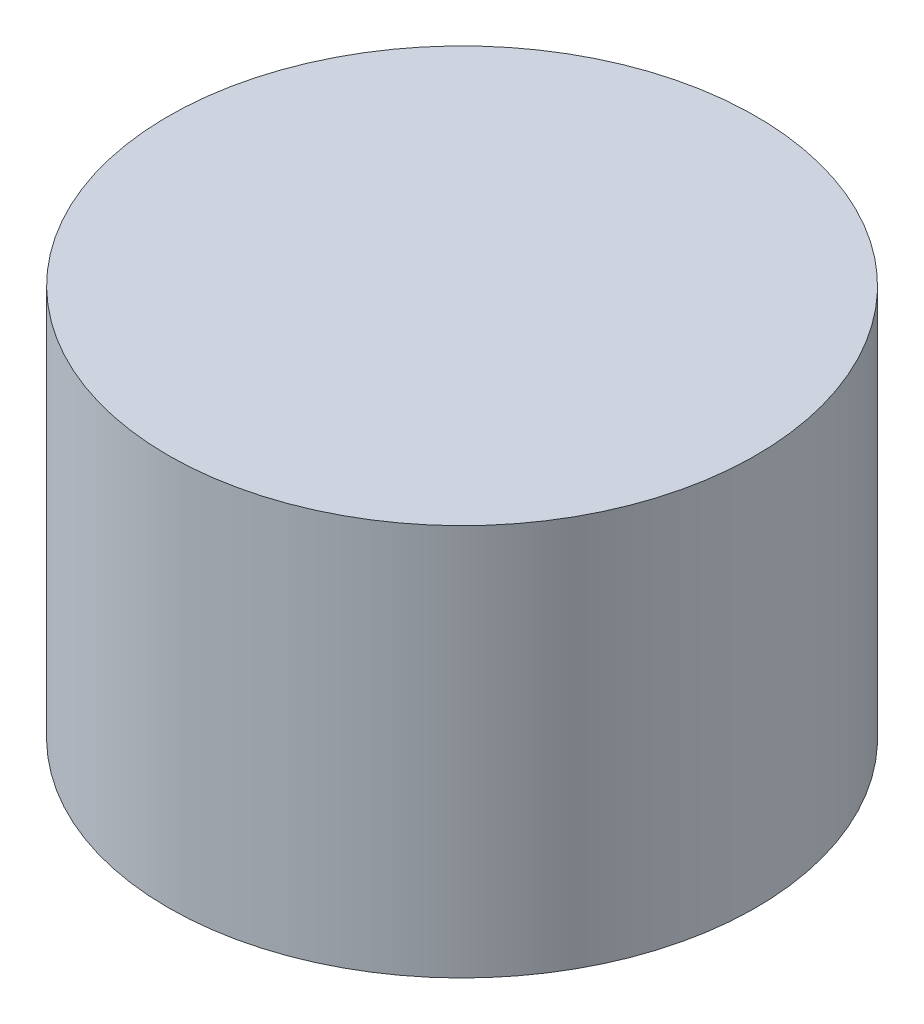
ISO-10303-21;
HEADER;
FILE_DESCRIPTION(('STEP AP214'),'2;1');
FILE_NAME('part.step','',(''),(''),'','','');
FILE_SCHEMA(('AUTOMOTIVE_DESIGN { 1 0 10303 214 1 1 1 1 }'));
ENDSEC;
DATA;
#1=APPLICATION_CONTEXT('core data for automotive mechanical design processes');
#2=APPLICATION_PROTOCOL_DEFINITION('international standard','automotive_design',2000,#1);
#3=PRODUCT_CONTEXT('',#1,'mechanical');
#4=PRODUCT('Part','Part','',(#3));
#5=PRODUCT_RELATED_PRODUCT_CATEGORY('part','',(#4));
#6=PRODUCT_DEFINITION_FORMATION('','',#4);
#7=PRODUCT_DEFINITION_CONTEXT('part definition',#1,'design');
#8=PRODUCT_DEFINITION('design','',#6,#7);
#9=PRODUCT_DEFINITION_SHAPE('','',#8);
#10=(LENGTH_UNIT() NAMED_UNIT(*) SI_UNIT(.MILLI.,.METRE.));
#11=(NAMED_UNIT(*) PLANE_ANGLE_UNIT() SI_UNIT($,.RADIAN.));
#12=(NAMED_UNIT(*) SI_UNIT($,.STERADIAN.) SOLID_ANGLE_UNIT());
#13=UNCERTAINTY_MEASURE_WITH_UNIT(LENGTH_MEASURE(1.E-05),#10,'distance_accuracy_value','');
#14=(GEOMETRIC_REPRESENTATION_CONTEXT(3) GLOBAL_UNCERTAINTY_ASSIGNED_CONTEXT((#13)) GLOBAL_UNIT_ASSIGNED_CONTEXT((#10,
#11,#12)) REPRESENTATION_CONTEXT('',''));
#15=CARTESIAN_POINT('',(0.,0.,0.));
#16=DIRECTION('',(0.,0.,1.));
#17=DIRECTION('',(1.,0.,0.));
#18=AXIS2_PLACEMENT_3D('',#15,#16,#17);
#19=CARTESIAN_POINT('',(0.,4.,0.));
#20=DIRECTION('',(0.,-1.,0.));
#21=DIRECTION('',(0.,0.,-1.));
#22=AXIS2_PLACEMENT_3D('',#19,#20,#21);
#23=CYLINDRICAL_SURFACE('',#22,3.);
#24=CARTESIAN_POINT('',(0.,4.,0.));
#25=DIRECTION('',(0.,1.,0.));
#26=DIRECTION('',(0.,0.,1.));
#27=AXIS2_PLACEMENT_3D('',#24,#25,#26);
#28=CIRCLE('',#27,3.);
#29=CARTESIAN_POINT('',(0.,4.,3.));
#30=VERTEX_POINT('',#29);
#31=EDGE_CURVE('E10',#30,#30,#28,.T.);
#32=ORIENTED_EDGE('',*,*,#31,.F.);
#33=EDGE_LOOP('',(#32));
#34=FACE_BOUND('',#33,.T.);
#35=CARTESIAN_POINT('',(0.,0.,0.));
#36=DIRECTION('',(0.,1.,0.));
#37=DIRECTION('',(0.,0.,1.));
#38=AXIS2_PLACEMENT_3D('',#35,#36,#37);
#39=CIRCLE('',#38,3.);
#40=CARTESIAN_POINT('',(0.,0.,3.));
#41=VERTEX_POINT('',#40);
#42=EDGE_CURVE('E40',#41,#41,#39,.T.);
#43=ORIENTED_EDGE('',*,*,#42,.T.);
#44=EDGE_LOOP('',(#43));
#45=FACE_BOUND('',#44,.T.);
#46=ADVANCED_FACE('F37',(#34,#45),#23,.T.);
#47=CARTESIAN_POINT('',(0.,4.,0.));
#48=DIRECTION('',(0.,1.,0.));
#49=DIRECTION('',(0.,0.,1.));
#50=AXIS2_PLACEMENT_3D('',#47,#48,#49);
#51=PLANE('',#50);
#52=ORIENTED_EDGE('',*,*,#31,.T.);
#53=EDGE_LOOP('',(#52));
#54=FACE_BOUND('',#53,.T.);
#55=ADVANCED_FACE('F52',(#54),#51,.T.);
#56=CARTESIAN_POINT('',(0.,0.,0.));
#57=DIRECTION('',(0.,1.,0.));
#58=DIRECTION('',(0.,0.,1.));
#59=AXIS2_PLACEMENT_3D('',#56,#57,#58);
#60=PLANE('',#59);
#61=ORIENTED_EDGE('',*,*,#42,.F.);
#62=EDGE_LOOP('',(#61));
#63=FACE_BOUND('',#62,.T.);
#64=ADVANCED_FACE('F50',(#63),#60,.F.);
#65=CLOSED_SHELL('',(#46,#55,#64));
#66=MANIFOLD_SOLID_BREP('B2',#65);
#67=ADVANCED_BREP_SHAPE_REPRESENTATION('',(#18,#66),#14);
#68=SHAPE_DEFINITION_REPRESENTATION(#9,#67);
ENDSEC;
END-ISO-10303-21;
